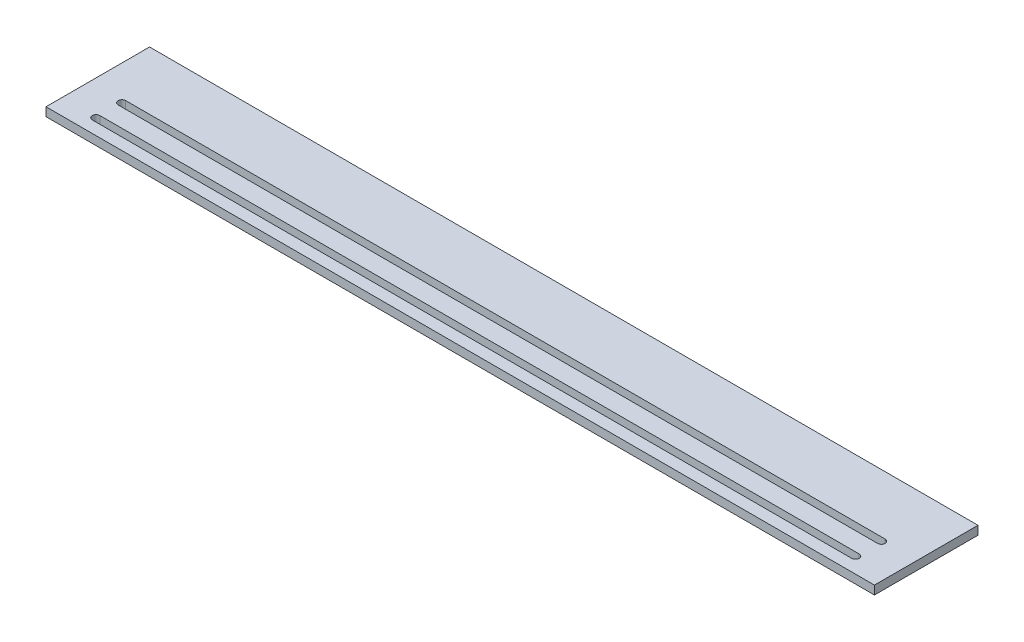
ISO-10303-21;
HEADER;
FILE_DESCRIPTION(('STEP AP214'),'2;1');
FILE_NAME('part.step','',(''),(''),'','','');
FILE_SCHEMA(('AUTOMOTIVE_DESIGN { 1 0 10303 214 1 1 1 1 }'));
ENDSEC;
DATA;
#1=APPLICATION_CONTEXT('core data for automotive mechanical design processes');
#2=APPLICATION_PROTOCOL_DEFINITION('international standard','automotive_design',2000,#1);
#3=PRODUCT_CONTEXT('',#1,'mechanical');
#4=PRODUCT('Part','Part','',(#3));
#5=PRODUCT_RELATED_PRODUCT_CATEGORY('part','',(#4));
#6=PRODUCT_DEFINITION_FORMATION('','',#4);
#7=PRODUCT_DEFINITION_CONTEXT('part definition',#1,'design');
#8=PRODUCT_DEFINITION('design','',#6,#7);
#9=PRODUCT_DEFINITION_SHAPE('','',#8);
#10=(LENGTH_UNIT() NAMED_UNIT(*) SI_UNIT(.MILLI.,.METRE.));
#11=(NAMED_UNIT(*) PLANE_ANGLE_UNIT() SI_UNIT($,.RADIAN.));
#12=(NAMED_UNIT(*) SI_UNIT($,.STERADIAN.) SOLID_ANGLE_UNIT());
#13=UNCERTAINTY_MEASURE_WITH_UNIT(LENGTH_MEASURE(1.E-05),#10,'distance_accuracy_value','');
#14=(GEOMETRIC_REPRESENTATION_CONTEXT(3) GLOBAL_UNCERTAINTY_ASSIGNED_CONTEXT((#13)) GLOBAL_UNIT_ASSIGNED_CONTEXT((#10,
#11,#12)) REPRESENTATION_CONTEXT('',''));
#15=CARTESIAN_POINT('',(0.,0.,0.));
#16=DIRECTION('',(0.,0.,1.));
#17=DIRECTION('',(1.,0.,0.));
#18=AXIS2_PLACEMENT_3D('',#15,#16,#17);
#19=CARTESIAN_POINT('',(304.8,3.175,38.1));
#20=DIRECTION('',(-1.,0.,0.));
#21=DIRECTION('',(0.,0.,1.));
#22=AXIS2_PLACEMENT_3D('',#19,#20,#21);
#23=PLANE('',#22);
#24=DIRECTION('',(0.,0.,-1.));
#25=VECTOR('',#24,1.);
#26=CARTESIAN_POINT('',(304.8,-3.175,38.1));
#27=LINE('',#26,#25);
#28=CARTESIAN_POINT('',(304.8,-3.175,38.1));
#29=VERTEX_POINT('',#28);
#30=CARTESIAN_POINT('',(304.8,-3.175,-38.1));
#31=VERTEX_POINT('',#30);
#32=EDGE_CURVE('E174',#29,#31,#27,.T.);
#33=ORIENTED_EDGE('',*,*,#32,.T.);
#34=DIRECTION('',(0.,-1.,0.));
#35=VECTOR('',#34,1.);
#36=CARTESIAN_POINT('',(304.8,3.175,-38.1));
#37=LINE('',#36,#35);
#38=CARTESIAN_POINT('',(304.8,3.175,-38.1));
#39=VERTEX_POINT('',#38);
#40=EDGE_CURVE('E11',#39,#31,#37,.T.);
#41=ORIENTED_EDGE('',*,*,#40,.F.);
#42=DIRECTION('',(0.,0.,-1.));
#43=VECTOR('',#42,1.);
#44=CARTESIAN_POINT('',(304.8,3.175,38.1));
#45=LINE('',#44,#43);
#46=CARTESIAN_POINT('',(304.8,3.175,38.1));
#47=VERTEX_POINT('',#46);
#48=EDGE_CURVE('E221',#47,#39,#45,.T.);
#49=ORIENTED_EDGE('',*,*,#48,.F.);
#50=DIRECTION('',(0.,-1.,0.));
#51=VECTOR('',#50,1.);
#52=CARTESIAN_POINT('',(304.8,3.175,38.1));
#53=LINE('',#52,#51);
#54=EDGE_CURVE('E235',#47,#29,#53,.T.);
#55=ORIENTED_EDGE('',*,*,#54,.T.);
#56=EDGE_LOOP('',(#33,#41,#49,#55));
#57=FACE_BOUND('',#56,.T.);
#58=ADVANCED_FACE('F38',(#57),#23,.F.);
#59=CARTESIAN_POINT('',(-304.8,3.175,-38.1));
#60=DIRECTION('',(0.,0.,1.));
#61=DIRECTION('',(1.,0.,0.));
#62=AXIS2_PLACEMENT_3D('',#59,#60,#61);
#63=PLANE('',#62);
#64=DIRECTION('',(-1.,0.,0.));
#65=VECTOR('',#64,1.);
#66=CARTESIAN_POINT('',(-304.8,-3.175,-38.1));
#67=LINE('',#66,#65);
#68=CARTESIAN_POINT('',(-304.8,-3.175,-38.1));
#69=VERTEX_POINT('',#68);
#70=EDGE_CURVE('E239',#31,#69,#67,.T.);
#71=ORIENTED_EDGE('',*,*,#70,.T.);
#72=DIRECTION('',(0.,-1.,0.));
#73=VECTOR('',#72,1.);
#74=CARTESIAN_POINT('',(-304.8,3.175,-38.1));
#75=LINE('',#74,#73);
#76=CARTESIAN_POINT('',(-304.8,3.175,-38.1));
#77=VERTEX_POINT('',#76);
#78=EDGE_CURVE('E46',#77,#69,#75,.T.);
#79=ORIENTED_EDGE('',*,*,#78,.F.);
#80=DIRECTION('',(-1.,0.,0.));
#81=VECTOR('',#80,1.);
#82=CARTESIAN_POINT('',(-304.8,3.175,-38.1));
#83=LINE('',#82,#81);
#84=EDGE_CURVE('E225',#39,#77,#83,.T.);
#85=ORIENTED_EDGE('',*,*,#84,.F.);
#86=ORIENTED_EDGE('',*,*,#40,.T.);
#87=EDGE_LOOP('',(#71,#79,#85,#86));
#88=FACE_BOUND('',#87,.T.);
#89=ADVANCED_FACE('F274',(#88),#63,.F.);
#90=CARTESIAN_POINT('',(-304.8,3.175,38.1));
#91=DIRECTION('',(1.,0.,0.));
#92=DIRECTION('',(0.,0.,-1.));
#93=AXIS2_PLACEMENT_3D('',#90,#91,#92);
#94=PLANE('',#93);
#95=DIRECTION('',(0.,0.,1.));
#96=VECTOR('',#95,1.);
#97=CARTESIAN_POINT('',(-304.8,-3.175,38.1));
#98=LINE('',#97,#96);
#99=CARTESIAN_POINT('',(-304.8,-3.175,38.1));
#100=VERTEX_POINT('',#99);
#101=EDGE_CURVE('E242',#69,#100,#98,.T.);
#102=ORIENTED_EDGE('',*,*,#101,.T.);
#103=DIRECTION('',(0.,-1.,0.));
#104=VECTOR('',#103,1.);
#105=CARTESIAN_POINT('',(-304.8,3.175,38.1));
#106=LINE('',#105,#104);
#107=CARTESIAN_POINT('',(-304.8,3.175,38.1));
#108=VERTEX_POINT('',#107);
#109=EDGE_CURVE('E250',#108,#100,#106,.T.);
#110=ORIENTED_EDGE('',*,*,#109,.F.);
#111=DIRECTION('',(0.,0.,1.));
#112=VECTOR('',#111,1.);
#113=CARTESIAN_POINT('',(-304.8,3.175,38.1));
#114=LINE('',#113,#112);
#115=EDGE_CURVE('E229',#77,#108,#114,.T.);
#116=ORIENTED_EDGE('',*,*,#115,.F.);
#117=ORIENTED_EDGE('',*,*,#78,.T.);
#118=EDGE_LOOP('',(#102,#110,#116,#117));
#119=FACE_BOUND('',#118,.T.);
#120=ADVANCED_FACE('F259',(#119),#94,.F.);
#121=CARTESIAN_POINT('',(-304.8,3.175,38.1));
#122=DIRECTION('',(0.,0.,-1.));
#123=DIRECTION('',(-1.,0.,0.));
#124=AXIS2_PLACEMENT_3D('',#121,#122,#123);
#125=PLANE('',#124);
#126=DIRECTION('',(1.,0.,0.));
#127=VECTOR('',#126,1.);
#128=CARTESIAN_POINT('',(-304.8,-3.175,38.1));
#129=LINE('',#128,#127);
#130=EDGE_CURVE('E226',#100,#29,#129,.T.);
#131=ORIENTED_EDGE('',*,*,#130,.T.);
#132=ORIENTED_EDGE('',*,*,#54,.F.);
#133=DIRECTION('',(1.,0.,0.));
#134=VECTOR('',#133,1.);
#135=CARTESIAN_POINT('',(-304.8,3.175,38.1));
#136=LINE('',#135,#134);
#137=EDGE_CURVE('E232',#108,#47,#136,.T.);
#138=ORIENTED_EDGE('',*,*,#137,.F.);
#139=ORIENTED_EDGE('',*,*,#109,.T.);
#140=EDGE_LOOP('',(#131,#132,#138,#139));
#141=FACE_BOUND('',#140,.T.);
#142=ADVANCED_FACE('F267',(#141),#125,.F.);
#143=CARTESIAN_POINT('',(0.,3.175,0.));
#144=DIRECTION('',(0.,-1.,0.));
#145=DIRECTION('',(0.,0.,-1.));
#146=AXIS2_PLACEMENT_3D('',#143,#144,#145);
#147=PLANE('',#146);
#148=DIRECTION('',(1.,0.,0.));
#149=VECTOR('',#148,1.);
#150=CARTESIAN_POINT('',(-279.4,3.175,10.3981250000001));
#151=LINE('',#150,#149);
#152=CARTESIAN_POINT('',(-279.4,3.175,10.3981250000001));
#153=VERTEX_POINT('',#152);
#154=CARTESIAN_POINT('',(279.4,3.175,10.3981250000001));
#155=VERTEX_POINT('',#154);
#156=EDGE_CURVE('E164',#153,#155,#151,.T.);
#157=ORIENTED_EDGE('',*,*,#156,.F.);
#158=CARTESIAN_POINT('',(-279.4,3.175,7.62000000000012));
#159=DIRECTION('',(0.,1.,0.));
#160=DIRECTION('',(0.,0.,1.));
#161=AXIS2_PLACEMENT_3D('',#158,#159,#160);
#162=CIRCLE('',#161,2.778125);
#163=CARTESIAN_POINT('',(-279.4,3.175,4.84187500000012));
#164=VERTEX_POINT('',#163);
#165=EDGE_CURVE('E53',#164,#153,#162,.T.);
#166=ORIENTED_EDGE('',*,*,#165,.F.);
#167=DIRECTION('',(-1.,0.,0.));
#168=VECTOR('',#167,1.);
#169=CARTESIAN_POINT('',(-279.4,3.175,4.84187500000012));
#170=LINE('',#169,#168);
#171=CARTESIAN_POINT('',(279.4,3.175,4.84187500000012));
#172=VERTEX_POINT('',#171);
#173=EDGE_CURVE('E151',#172,#164,#170,.T.);
#174=ORIENTED_EDGE('',*,*,#173,.F.);
#175=CARTESIAN_POINT('',(279.4,3.175,7.62000000000012));
#176=DIRECTION('',(0.,1.,0.));
#177=DIRECTION('',(0.,0.,1.));
#178=AXIS2_PLACEMENT_3D('',#175,#176,#177);
#179=CIRCLE('',#178,2.778125);
#180=EDGE_CURVE('E155',#155,#172,#179,.T.);
#181=ORIENTED_EDGE('',*,*,#180,.F.);
#182=EDGE_LOOP('',(#157,#166,#174,#181));
#183=FACE_BOUND('',#182,.T.);
#184=DIRECTION('',(1.,0.,0.));
#185=VECTOR('',#184,1.);
#186=CARTESIAN_POINT('',(-279.4,3.175,29.4481250000001));
#187=LINE('',#186,#185);
#188=CARTESIAN_POINT('',(-279.4,3.175,29.4481250000001));
#189=VERTEX_POINT('',#188);
#190=CARTESIAN_POINT('',(279.4,3.175,29.4481250000001));
#191=VERTEX_POINT('',#190);
#192=EDGE_CURVE('E200',#189,#191,#187,.T.);
#193=ORIENTED_EDGE('',*,*,#192,.F.);
#194=CARTESIAN_POINT('',(-279.4,3.175,26.6700000000001));
#195=DIRECTION('',(0.,1.,0.));
#196=DIRECTION('',(0.,0.,1.));
#197=AXIS2_PLACEMENT_3D('',#194,#195,#196);
#198=CIRCLE('',#197,2.778125);
#199=CARTESIAN_POINT('',(-279.4,3.175,23.8918750000001));
#200=VERTEX_POINT('',#199);
#201=EDGE_CURVE('E61',#200,#189,#198,.T.);
#202=ORIENTED_EDGE('',*,*,#201,.F.);
#203=DIRECTION('',(-1.,0.,0.));
#204=VECTOR('',#203,1.);
#205=CARTESIAN_POINT('',(-279.4,3.175,23.8918750000001));
#206=LINE('',#205,#204);
#207=CARTESIAN_POINT('',(279.4,3.175,23.8918750000001));
#208=VERTEX_POINT('',#207);
#209=EDGE_CURVE('E185',#208,#200,#206,.T.);
#210=ORIENTED_EDGE('',*,*,#209,.F.);
#211=CARTESIAN_POINT('',(279.4,3.175,26.6700000000001));
#212=DIRECTION('',(0.,1.,0.));
#213=DIRECTION('',(0.,0.,1.));
#214=AXIS2_PLACEMENT_3D('',#211,#212,#213);
#215=CIRCLE('',#214,2.778125);
#216=EDGE_CURVE('E204',#191,#208,#215,.T.);
#217=ORIENTED_EDGE('',*,*,#216,.F.);
#218=EDGE_LOOP('',(#193,#202,#210,#217));
#219=FACE_BOUND('',#218,.T.);
#220=ORIENTED_EDGE('',*,*,#48,.T.);
#221=ORIENTED_EDGE('',*,*,#84,.T.);
#222=ORIENTED_EDGE('',*,*,#115,.T.);
#223=ORIENTED_EDGE('',*,*,#137,.T.);
#224=EDGE_LOOP('',(#220,#221,#222,#223));
#225=FACE_BOUND('',#224,.T.);
#226=ADVANCED_FACE('F273',(#183,#219,#225),#147,.F.);
#227=CARTESIAN_POINT('',(0.,-3.175,0.));
#228=DIRECTION('',(0.,-1.,0.));
#229=DIRECTION('',(0.,0.,-1.));
#230=AXIS2_PLACEMENT_3D('',#227,#228,#229);
#231=PLANE('',#230);
#232=CARTESIAN_POINT('',(-279.4,-3.175,7.62000000000012));
#233=DIRECTION('',(0.,1.,0.));
#234=DIRECTION('',(0.,0.,1.));
#235=AXIS2_PLACEMENT_3D('',#232,#233,#234);
#236=CIRCLE('',#235,2.778125);
#237=CARTESIAN_POINT('',(-279.4,-3.175,4.84187500000012));
#238=VERTEX_POINT('',#237);
#239=CARTESIAN_POINT('',(-279.4,-3.175,10.3981250000001));
#240=VERTEX_POINT('',#239);
#241=EDGE_CURVE('E129',#238,#240,#236,.T.);
#242=ORIENTED_EDGE('',*,*,#241,.T.);
#243=DIRECTION('',(1.,0.,0.));
#244=VECTOR('',#243,1.);
#245=CARTESIAN_POINT('',(-279.4,-3.175,10.3981250000001));
#246=LINE('',#245,#244);
#247=CARTESIAN_POINT('',(279.4,-3.175,10.3981250000001));
#248=VERTEX_POINT('',#247);
#249=EDGE_CURVE('E140',#240,#248,#246,.T.);
#250=ORIENTED_EDGE('',*,*,#249,.T.);
#251=CARTESIAN_POINT('',(279.4,-3.175,7.62000000000012));
#252=DIRECTION('',(0.,1.,0.));
#253=DIRECTION('',(0.,0.,1.));
#254=AXIS2_PLACEMENT_3D('',#251,#252,#253);
#255=CIRCLE('',#254,2.778125);
#256=CARTESIAN_POINT('',(279.4,-3.175,4.84187500000012));
#257=VERTEX_POINT('',#256);
#258=EDGE_CURVE('E145',#248,#257,#255,.T.);
#259=ORIENTED_EDGE('',*,*,#258,.T.);
#260=DIRECTION('',(-1.,0.,0.));
#261=VECTOR('',#260,1.);
#262=CARTESIAN_POINT('',(-279.4,-3.175,4.84187500000012));
#263=LINE('',#262,#261);
#264=EDGE_CURVE('E136',#257,#238,#263,.T.);
#265=ORIENTED_EDGE('',*,*,#264,.T.);
#266=EDGE_LOOP('',(#242,#250,#259,#265));
#267=FACE_BOUND('',#266,.T.);
#268=CARTESIAN_POINT('',(-279.4,-3.175,26.6700000000001));
#269=DIRECTION('',(0.,1.,0.));
#270=DIRECTION('',(0.,0.,1.));
#271=AXIS2_PLACEMENT_3D('',#268,#269,#270);
#272=CIRCLE('',#271,2.778125);
#273=CARTESIAN_POINT('',(-279.4,-3.175,23.8918750000001));
#274=VERTEX_POINT('',#273);
#275=CARTESIAN_POINT('',(-279.4,-3.175,29.4481250000001));
#276=VERTEX_POINT('',#275);
#277=EDGE_CURVE('E180',#274,#276,#272,.T.);
#278=ORIENTED_EDGE('',*,*,#277,.T.);
#279=DIRECTION('',(1.,0.,0.));
#280=VECTOR('',#279,1.);
#281=CARTESIAN_POINT('',(-279.4,-3.175,29.4481250000001));
#282=LINE('',#281,#280);
#283=CARTESIAN_POINT('',(279.4,-3.175,29.4481250000001));
#284=VERTEX_POINT('',#283);
#285=EDGE_CURVE('E184',#276,#284,#282,.T.);
#286=ORIENTED_EDGE('',*,*,#285,.T.);
#287=CARTESIAN_POINT('',(279.4,-3.175,26.6700000000001));
#288=DIRECTION('',(0.,1.,0.));
#289=DIRECTION('',(0.,0.,1.));
#290=AXIS2_PLACEMENT_3D('',#287,#288,#289);
#291=CIRCLE('',#290,2.778125);
#292=CARTESIAN_POINT('',(279.4,-3.175,23.8918750000001));
#293=VERTEX_POINT('',#292);
#294=EDGE_CURVE('E189',#284,#293,#291,.T.);
#295=ORIENTED_EDGE('',*,*,#294,.T.);
#296=DIRECTION('',(-1.,0.,0.));
#297=VECTOR('',#296,1.);
#298=CARTESIAN_POINT('',(-279.4,-3.175,23.8918750000001));
#299=LINE('',#298,#297);
#300=EDGE_CURVE('E193',#293,#274,#299,.T.);
#301=ORIENTED_EDGE('',*,*,#300,.T.);
#302=EDGE_LOOP('',(#278,#286,#295,#301));
#303=FACE_BOUND('',#302,.T.);
#304=ORIENTED_EDGE('',*,*,#32,.F.);
#305=ORIENTED_EDGE('',*,*,#130,.F.);
#306=ORIENTED_EDGE('',*,*,#101,.F.);
#307=ORIENTED_EDGE('',*,*,#70,.F.);
#308=EDGE_LOOP('',(#304,#305,#306,#307));
#309=FACE_BOUND('',#308,.T.);
#310=ADVANCED_FACE('F147',(#267,#303,#309),#231,.T.);
#311=CARTESIAN_POINT('',(-279.4,-3.175,26.6700000000001));
#312=DIRECTION('',(0.,1.,0.));
#313=DIRECTION('',(0.,0.,1.));
#314=AXIS2_PLACEMENT_3D('',#311,#312,#313);
#315=CYLINDRICAL_SURFACE('',#314,2.778125);
#316=ORIENTED_EDGE('',*,*,#201,.T.);
#317=DIRECTION('',(0.,1.,0.));
#318=VECTOR('',#317,1.);
#319=CARTESIAN_POINT('',(-279.4,-3.175,29.4481250000001));
#320=LINE('',#319,#318);
#321=EDGE_CURVE('E197',#276,#189,#320,.T.);
#322=ORIENTED_EDGE('',*,*,#321,.F.);
#323=ORIENTED_EDGE('',*,*,#277,.F.);
#324=DIRECTION('',(0.,1.,0.));
#325=VECTOR('',#324,1.);
#326=CARTESIAN_POINT('',(-279.4,-3.175,23.8918750000001));
#327=LINE('',#326,#325);
#328=EDGE_CURVE('E165',#274,#200,#327,.T.);
#329=ORIENTED_EDGE('',*,*,#328,.T.);
#330=EDGE_LOOP('',(#316,#322,#323,#329));
#331=FACE_BOUND('',#330,.T.);
#332=ADVANCED_FACE('F286',(#331),#315,.F.);
#333=CARTESIAN_POINT('',(-279.4,-3.175,23.8918750000001));
#334=DIRECTION('',(0.,0.,-1.));
#335=DIRECTION('',(-1.,0.,0.));
#336=AXIS2_PLACEMENT_3D('',#333,#334,#335);
#337=PLANE('',#336);
#338=ORIENTED_EDGE('',*,*,#209,.T.);
#339=ORIENTED_EDGE('',*,*,#328,.F.);
#340=ORIENTED_EDGE('',*,*,#300,.F.);
#341=DIRECTION('',(0.,1.,0.));
#342=VECTOR('',#341,1.);
#343=CARTESIAN_POINT('',(279.4,-3.175,23.8918750000001));
#344=LINE('',#343,#342);
#345=EDGE_CURVE('E213',#293,#208,#344,.T.);
#346=ORIENTED_EDGE('',*,*,#345,.T.);
#347=EDGE_LOOP('',(#338,#339,#340,#346));
#348=FACE_BOUND('',#347,.T.);
#349=ADVANCED_FACE('F292',(#348),#337,.F.);
#350=CARTESIAN_POINT('',(279.4,-3.175,26.6700000000001));
#351=DIRECTION('',(0.,1.,0.));
#352=DIRECTION('',(0.,0.,1.));
#353=AXIS2_PLACEMENT_3D('',#350,#351,#352);
#354=CYLINDRICAL_SURFACE('',#353,2.778125);
#355=ORIENTED_EDGE('',*,*,#216,.T.);
#356=ORIENTED_EDGE('',*,*,#345,.F.);
#357=ORIENTED_EDGE('',*,*,#294,.F.);
#358=DIRECTION('',(0.,1.,0.));
#359=VECTOR('',#358,1.);
#360=CARTESIAN_POINT('',(279.4,-3.175,29.4481250000001));
#361=LINE('',#360,#359);
#362=EDGE_CURVE('E216',#284,#191,#361,.T.);
#363=ORIENTED_EDGE('',*,*,#362,.T.);
#364=EDGE_LOOP('',(#355,#356,#357,#363));
#365=FACE_BOUND('',#364,.T.);
#366=ADVANCED_FACE('F296',(#365),#354,.F.);
#367=CARTESIAN_POINT('',(-279.4,-3.175,29.4481250000001));
#368=DIRECTION('',(0.,0.,1.));
#369=DIRECTION('',(1.,0.,0.));
#370=AXIS2_PLACEMENT_3D('',#367,#368,#369);
#371=PLANE('',#370);
#372=ORIENTED_EDGE('',*,*,#192,.T.);
#373=ORIENTED_EDGE('',*,*,#362,.F.);
#374=ORIENTED_EDGE('',*,*,#285,.F.);
#375=ORIENTED_EDGE('',*,*,#321,.T.);
#376=EDGE_LOOP('',(#372,#373,#374,#375));
#377=FACE_BOUND('',#376,.T.);
#378=ADVANCED_FACE('F293',(#377),#371,.F.);
#379=CARTESIAN_POINT('',(-279.4,-3.175,7.62000000000012));
#380=DIRECTION('',(0.,1.,0.));
#381=DIRECTION('',(0.,0.,1.));
#382=AXIS2_PLACEMENT_3D('',#379,#380,#381);
#383=CYLINDRICAL_SURFACE('',#382,2.778125);
#384=ORIENTED_EDGE('',*,*,#165,.T.);
#385=DIRECTION('',(0.,1.,0.));
#386=VECTOR('',#385,1.);
#387=CARTESIAN_POINT('',(-279.4,-3.175,10.3981250000001));
#388=LINE('',#387,#386);
#389=EDGE_CURVE('E125',#240,#153,#388,.T.);
#390=ORIENTED_EDGE('',*,*,#389,.F.);
#391=ORIENTED_EDGE('',*,*,#241,.F.);
#392=DIRECTION('',(0.,1.,0.));
#393=VECTOR('',#392,1.);
#394=CARTESIAN_POINT('',(-279.4,-3.175,4.84187500000012));
#395=LINE('',#394,#393);
#396=EDGE_CURVE('E171',#238,#164,#395,.T.);
#397=ORIENTED_EDGE('',*,*,#396,.T.);
#398=EDGE_LOOP('',(#384,#390,#391,#397));
#399=FACE_BOUND('',#398,.T.);
#400=ADVANCED_FACE('F127',(#399),#383,.F.);
#401=CARTESIAN_POINT('',(-279.4,-3.175,4.84187500000012));
#402=DIRECTION('',(0.,0.,-1.));
#403=DIRECTION('',(-1.,0.,0.));
#404=AXIS2_PLACEMENT_3D('',#401,#402,#403);
#405=PLANE('',#404);
#406=ORIENTED_EDGE('',*,*,#173,.T.);
#407=ORIENTED_EDGE('',*,*,#396,.F.);
#408=ORIENTED_EDGE('',*,*,#264,.F.);
#409=DIRECTION('',(0.,1.,0.));
#410=VECTOR('',#409,1.);
#411=CARTESIAN_POINT('',(279.4,-3.175,4.84187500000012));
#412=LINE('',#411,#410);
#413=EDGE_CURVE('E175',#257,#172,#412,.T.);
#414=ORIENTED_EDGE('',*,*,#413,.T.);
#415=EDGE_LOOP('',(#406,#407,#408,#414));
#416=FACE_BOUND('',#415,.T.);
#417=ADVANCED_FACE('F306',(#416),#405,.F.);
#418=CARTESIAN_POINT('',(279.4,-3.175,7.62000000000012));
#419=DIRECTION('',(0.,1.,0.));
#420=DIRECTION('',(0.,0.,1.));
#421=AXIS2_PLACEMENT_3D('',#418,#419,#420);
#422=CYLINDRICAL_SURFACE('',#421,2.778125);
#423=ORIENTED_EDGE('',*,*,#180,.T.);
#424=ORIENTED_EDGE('',*,*,#413,.F.);
#425=ORIENTED_EDGE('',*,*,#258,.F.);
#426=DIRECTION('',(0.,1.,0.));
#427=VECTOR('',#426,1.);
#428=CARTESIAN_POINT('',(279.4,-3.175,10.3981250000001));
#429=LINE('',#428,#427);
#430=EDGE_CURVE('E135',#248,#155,#429,.T.);
#431=ORIENTED_EDGE('',*,*,#430,.T.);
#432=EDGE_LOOP('',(#423,#424,#425,#431));
#433=FACE_BOUND('',#432,.T.);
#434=ADVANCED_FACE('F309',(#433),#422,.F.);
#435=CARTESIAN_POINT('',(-279.4,-3.175,10.3981250000001));
#436=DIRECTION('',(0.,0.,1.));
#437=DIRECTION('',(1.,0.,0.));
#438=AXIS2_PLACEMENT_3D('',#435,#436,#437);
#439=PLANE('',#438);
#440=ORIENTED_EDGE('',*,*,#156,.T.);
#441=ORIENTED_EDGE('',*,*,#430,.F.);
#442=ORIENTED_EDGE('',*,*,#249,.F.);
#443=ORIENTED_EDGE('',*,*,#389,.T.);
#444=EDGE_LOOP('',(#440,#441,#442,#443));
#445=FACE_BOUND('',#444,.T.);
#446=ADVANCED_FACE('F141',(#445),#439,.F.);
#447=CLOSED_SHELL('',(#58,#89,#120,#142,#226,#310,#332,#349,#366,#378,#400,#417,#434,#446));
#448=MANIFOLD_SOLID_BREP('B2',#447);
#449=ADVANCED_BREP_SHAPE_REPRESENTATION('',(#18,#448),#14);
#450=SHAPE_DEFINITION_REPRESENTATION(#9,#449);
ENDSEC;
END-ISO-10303-21;
